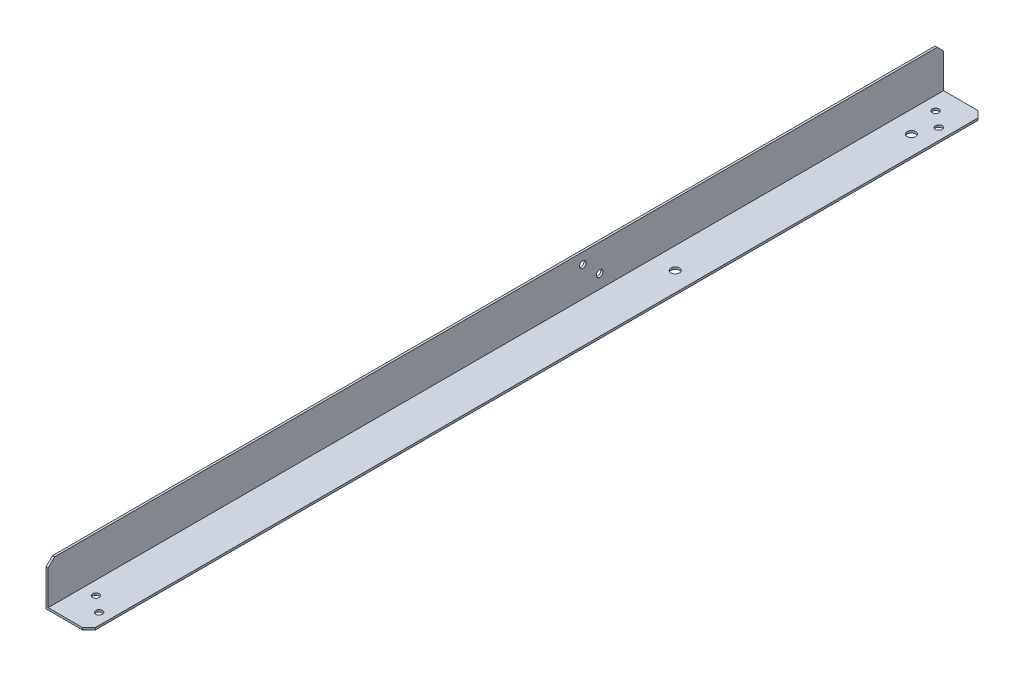
ISO-10303-21;
HEADER;
FILE_DESCRIPTION(('STEP AP214'),'2;1');
FILE_NAME('part.step','',(''),(''),'','','');
FILE_SCHEMA(('AUTOMOTIVE_DESIGN { 1 0 10303 214 1 1 1 1 }'));
ENDSEC;
DATA;
#1=APPLICATION_CONTEXT('core data for automotive mechanical design processes');
#2=APPLICATION_PROTOCOL_DEFINITION('international standard','automotive_design',2000,#1);
#3=PRODUCT_CONTEXT('',#1,'mechanical');
#4=PRODUCT('Part','Part','',(#3));
#5=PRODUCT_RELATED_PRODUCT_CATEGORY('part','',(#4));
#6=PRODUCT_DEFINITION_FORMATION('','',#4);
#7=PRODUCT_DEFINITION_CONTEXT('part definition',#1,'design');
#8=PRODUCT_DEFINITION('design','',#6,#7);
#9=PRODUCT_DEFINITION_SHAPE('','',#8);
#10=(LENGTH_UNIT() NAMED_UNIT(*) SI_UNIT(.MILLI.,.METRE.));
#11=(NAMED_UNIT(*) PLANE_ANGLE_UNIT() SI_UNIT($,.RADIAN.));
#12=(NAMED_UNIT(*) SI_UNIT($,.STERADIAN.) SOLID_ANGLE_UNIT());
#13=UNCERTAINTY_MEASURE_WITH_UNIT(LENGTH_MEASURE(1.E-05),#10,'distance_accuracy_value','');
#14=(GEOMETRIC_REPRESENTATION_CONTEXT(3) GLOBAL_UNCERTAINTY_ASSIGNED_CONTEXT((#13)) GLOBAL_UNIT_ASSIGNED_CONTEXT((#10,
#11,#12)) REPRESENTATION_CONTEXT('',''));
#15=CARTESIAN_POINT('',(0.,0.,0.));
#16=DIRECTION('',(0.,0.,1.));
#17=DIRECTION('',(1.,0.,0.));
#18=AXIS2_PLACEMENT_3D('',#15,#16,#17);
#19=CARTESIAN_POINT('',(0.,20.,417.));
#20=DIRECTION('',(1.,0.,0.));
#21=DIRECTION('',(0.,1.,0.));
#22=AXIS2_PLACEMENT_3D('',#19,#20,#21);
#23=PLANE('',#22);
#24=CARTESIAN_POINT('',(0.,7.35,160.2));
#25=DIRECTION('',(1.,0.,0.));
#26=DIRECTION('',(0.,1.,0.));
#27=AXIS2_PLACEMENT_3D('',#24,#25,#26);
#28=CIRCLE('',#27,1.54999999999999);
#29=CARTESIAN_POINT('',(0.,8.89999999999999,160.2));
#30=VERTEX_POINT('',#29);
#31=EDGE_CURVE('E216',#30,#30,#28,.T.);
#32=ORIENTED_EDGE('',*,*,#31,.T.);
#33=EDGE_LOOP('',(#32));
#34=FACE_BOUND('',#33,.T.);
#35=CARTESIAN_POINT('',(0.,14.85,168.));
#36=DIRECTION('',(1.,0.,0.));
#37=DIRECTION('',(0.,1.,0.));
#38=AXIS2_PLACEMENT_3D('',#35,#36,#37);
#39=CIRCLE('',#38,1.54999999999999);
#40=CARTESIAN_POINT('',(0.,16.4,168.));
#41=VERTEX_POINT('',#40);
#42=EDGE_CURVE('E222',#41,#41,#39,.T.);
#43=ORIENTED_EDGE('',*,*,#42,.T.);
#44=EDGE_LOOP('',(#43));
#45=FACE_BOUND('',#44,.T.);
#46=DIRECTION('',(0.,-1.,0.));
#47=VECTOR('',#46,1.);
#48=CARTESIAN_POINT('',(0.,20.,417.));
#49=LINE('',#48,#47);
#50=CARTESIAN_POINT('',(0.,17.0000000000001,417.));
#51=VERTEX_POINT('',#50);
#52=CARTESIAN_POINT('',(0.,0.,417.));
#53=VERTEX_POINT('',#52);
#54=EDGE_CURVE('E116',#51,#53,#49,.T.);
#55=ORIENTED_EDGE('',*,*,#54,.F.);
#56=DIRECTION('',(0.,0.707106781186541,-0.707106781186554));
#57=VECTOR('',#56,1.);
#58=CARTESIAN_POINT('',(0.,17.0000000000001,417.));
#59=LINE('',#58,#57);
#60=CARTESIAN_POINT('',(0.,20.,414.));
#61=VERTEX_POINT('',#60);
#62=EDGE_CURVE('E165',#51,#61,#59,.T.);
#63=ORIENTED_EDGE('',*,*,#62,.T.);
#64=DIRECTION('',(0.,0.,-1.));
#65=VECTOR('',#64,1.);
#66=CARTESIAN_POINT('',(0.,20.,417.));
#67=LINE('',#66,#65);
#68=CARTESIAN_POINT('',(0.,20.,2.99999999999995));
#69=VERTEX_POINT('',#68);
#70=EDGE_CURVE('E228',#61,#69,#67,.T.);
#71=ORIENTED_EDGE('',*,*,#70,.T.);
#72=DIRECTION('',(0.,0.707106781186554,0.707106781186541));
#73=VECTOR('',#72,1.);
#74=CARTESIAN_POINT('',(0.,20.,2.99999999999995));
#75=LINE('',#74,#73);
#76=CARTESIAN_POINT('',(0.,17.,0.));
#77=VERTEX_POINT('',#76);
#78=EDGE_CURVE('E163',#69,#77,#75,.F.);
#79=ORIENTED_EDGE('',*,*,#78,.T.);
#80=DIRECTION('',(0.,-1.,0.));
#81=VECTOR('',#80,1.);
#82=CARTESIAN_POINT('',(0.,20.,0.));
#83=LINE('',#82,#81);
#84=CARTESIAN_POINT('',(0.,0.,0.));
#85=VERTEX_POINT('',#84);
#86=EDGE_CURVE('E139',#77,#85,#83,.T.);
#87=ORIENTED_EDGE('',*,*,#86,.T.);
#88=DIRECTION('',(0.,0.,-1.));
#89=VECTOR('',#88,1.);
#90=CARTESIAN_POINT('',(0.,0.,417.));
#91=LINE('',#90,#89);
#92=EDGE_CURVE('E134',#53,#85,#91,.T.);
#93=ORIENTED_EDGE('',*,*,#92,.F.);
#94=EDGE_LOOP('',(#55,#63,#71,#79,#87,#93));
#95=FACE_BOUND('',#94,.T.);
#96=ADVANCED_FACE('F35',(#34,#45,#95),#23,.F.);
#97=CARTESIAN_POINT('',(0.,0.,417.));
#98=DIRECTION('',(0.,1.,0.));
#99=DIRECTION('',(0.,0.,1.));
#100=AXIS2_PLACEMENT_3D('',#97,#98,#99);
#101=PLANE('',#100);
#102=CARTESIAN_POINT('',(11.,0.,25.));
#103=DIRECTION('',(0.,-1.,0.));
#104=DIRECTION('',(0.,0.,-1.));
#105=AXIS2_PLACEMENT_3D('',#102,#103,#104);
#106=CIRCLE('',#105,2.);
#107=CARTESIAN_POINT('',(11.,0.,23.));
#108=VERTEX_POINT('',#107);
#109=EDGE_CURVE('E192',#108,#108,#106,.T.);
#110=ORIENTED_EDGE('',*,*,#109,.F.);
#111=EDGE_LOOP('',(#110));
#112=FACE_BOUND('',#111,.T.);
#113=CARTESIAN_POINT('',(11.,0.,135.));
#114=DIRECTION('',(0.,-1.,0.));
#115=DIRECTION('',(0.,0.,-1.));
#116=AXIS2_PLACEMENT_3D('',#113,#114,#115);
#117=CIRCLE('',#116,2.);
#118=CARTESIAN_POINT('',(11.,0.,133.));
#119=VERTEX_POINT('',#118);
#120=EDGE_CURVE('E198',#119,#119,#117,.T.);
#121=ORIENTED_EDGE('',*,*,#120,.F.);
#122=EDGE_LOOP('',(#121));
#123=FACE_BOUND('',#122,.T.);
#124=CARTESIAN_POINT('',(14.7499999999952,0.,16.));
#125=DIRECTION('',(0.,-1.,0.));
#126=DIRECTION('',(0.,0.,-1.));
#127=AXIS2_PLACEMENT_3D('',#124,#125,#126);
#128=CIRCLE('',#127,1.55);
#129=CARTESIAN_POINT('',(14.7499999999952,0.,14.45));
#130=VERTEX_POINT('',#129);
#131=EDGE_CURVE('E185',#130,#130,#128,.T.);
#132=ORIENTED_EDGE('',*,*,#131,.F.);
#133=EDGE_LOOP('',(#132));
#134=FACE_BOUND('',#133,.T.);
#135=CARTESIAN_POINT('',(7.24999999999503,0.,401.));
#136=DIRECTION('',(0.,-1.,0.));
#137=DIRECTION('',(0.,0.,-1.));
#138=AXIS2_PLACEMENT_3D('',#135,#136,#137);
#139=CIRCLE('',#138,1.55000000000001);
#140=CARTESIAN_POINT('',(7.24999999999503,0.,399.45));
#141=VERTEX_POINT('',#140);
#142=EDGE_CURVE('E207',#141,#141,#139,.T.);
#143=ORIENTED_EDGE('',*,*,#142,.F.);
#144=EDGE_LOOP('',(#143));
#145=FACE_BOUND('',#144,.T.);
#146=CARTESIAN_POINT('',(14.749999999995,0.,407.));
#147=DIRECTION('',(0.,-1.,0.));
#148=DIRECTION('',(0.,0.,-1.));
#149=AXIS2_PLACEMENT_3D('',#146,#147,#148);
#150=CIRCLE('',#149,1.55000000000001);
#151=CARTESIAN_POINT('',(14.749999999995,0.,405.45));
#152=VERTEX_POINT('',#151);
#153=EDGE_CURVE('E196',#152,#152,#150,.T.);
#154=ORIENTED_EDGE('',*,*,#153,.F.);
#155=EDGE_LOOP('',(#154));
#156=FACE_BOUND('',#155,.T.);
#157=CARTESIAN_POINT('',(7.24999999999519,0.,9.9999999999999));
#158=DIRECTION('',(0.,-1.,0.));
#159=DIRECTION('',(0.,0.,-1.));
#160=AXIS2_PLACEMENT_3D('',#157,#158,#159);
#161=CIRCLE('',#160,1.55);
#162=CARTESIAN_POINT('',(7.24999999999519,0.,8.4499999999999));
#163=VERTEX_POINT('',#162);
#164=EDGE_CURVE('E180',#163,#163,#161,.T.);
#165=ORIENTED_EDGE('',*,*,#164,.F.);
#166=EDGE_LOOP('',(#165));
#167=FACE_BOUND('',#166,.T.);
#168=DIRECTION('',(0.,0.,-1.));
#169=VECTOR('',#168,1.);
#170=CARTESIAN_POINT('',(20.,0.,417.));
#171=LINE('',#170,#169);
#172=CARTESIAN_POINT('',(20.,0.,414.));
#173=VERTEX_POINT('',#172);
#174=CARTESIAN_POINT('',(20.,0.,2.99999999999995));
#175=VERTEX_POINT('',#174);
#176=EDGE_CURVE('E141',#173,#175,#171,.T.);
#177=ORIENTED_EDGE('',*,*,#176,.F.);
#178=DIRECTION('',(-0.707106781186541,0.,0.707106781186554));
#179=VECTOR('',#178,1.);
#180=CARTESIAN_POINT('',(17.0000000000001,0.,417.));
#181=LINE('',#180,#179);
#182=CARTESIAN_POINT('',(17.0000000000001,0.,417.));
#183=VERTEX_POINT('',#182);
#184=EDGE_CURVE('E136',#173,#183,#181,.T.);
#185=ORIENTED_EDGE('',*,*,#184,.T.);
#186=DIRECTION('',(1.,0.,0.));
#187=VECTOR('',#186,1.);
#188=CARTESIAN_POINT('',(0.,0.,417.));
#189=LINE('',#188,#187);
#190=EDGE_CURVE('E120',#53,#183,#189,.T.);
#191=ORIENTED_EDGE('',*,*,#190,.F.);
#192=ORIENTED_EDGE('',*,*,#92,.T.);
#193=DIRECTION('',(1.,0.,0.));
#194=VECTOR('',#193,1.);
#195=CARTESIAN_POINT('',(0.,0.,0.));
#196=LINE('',#195,#194);
#197=CARTESIAN_POINT('',(17.,0.,0.));
#198=VERTEX_POINT('',#197);
#199=EDGE_CURVE('E230',#85,#198,#196,.T.);
#200=ORIENTED_EDGE('',*,*,#199,.T.);
#201=DIRECTION('',(-0.707106781186554,0.,-0.707106781186541));
#202=VECTOR('',#201,1.);
#203=CARTESIAN_POINT('',(20.,0.,2.99999999999995));
#204=LINE('',#203,#202);
#205=EDGE_CURVE('E160',#198,#175,#204,.F.);
#206=ORIENTED_EDGE('',*,*,#205,.T.);
#207=EDGE_LOOP('',(#177,#185,#191,#192,#200,#206));
#208=FACE_BOUND('',#207,.T.);
#209=ADVANCED_FACE('F132',(#112,#123,#134,#145,#156,#167,#208),#101,.F.);
#210=CARTESIAN_POINT('',(20.,0.,417.));
#211=DIRECTION('',(-1.,0.,0.));
#212=DIRECTION('',(0.,0.,1.));
#213=AXIS2_PLACEMENT_3D('',#210,#211,#212);
#214=PLANE('',#213);
#215=DIRECTION('',(0.,0.,-1.));
#216=VECTOR('',#215,1.);
#217=CARTESIAN_POINT('',(20.,1.,417.));
#218=LINE('',#217,#216);
#219=CARTESIAN_POINT('',(20.,1.,414.));
#220=VERTEX_POINT('',#219);
#221=CARTESIAN_POINT('',(20.,1.,2.99999999999995));
#222=VERTEX_POINT('',#221);
#223=EDGE_CURVE('E146',#220,#222,#218,.T.);
#224=ORIENTED_EDGE('',*,*,#223,.F.);
#225=DIRECTION('',(0.,-1.,0.));
#226=VECTOR('',#225,1.);
#227=CARTESIAN_POINT('',(20.,0.,414.));
#228=LINE('',#227,#226);
#229=EDGE_CURVE('E158',#220,#173,#228,.T.);
#230=ORIENTED_EDGE('',*,*,#229,.T.);
#231=ORIENTED_EDGE('',*,*,#176,.T.);
#232=DIRECTION('',(0.,1.,0.));
#233=VECTOR('',#232,1.);
#234=CARTESIAN_POINT('',(20.,0.,2.99999999999995));
#235=LINE('',#234,#233);
#236=EDGE_CURVE('E155',#175,#222,#235,.T.);
#237=ORIENTED_EDGE('',*,*,#236,.T.);
#238=EDGE_LOOP('',(#224,#230,#231,#237));
#239=FACE_BOUND('',#238,.T.);
#240=ADVANCED_FACE('F249',(#239),#214,.F.);
#241=CARTESIAN_POINT('',(20.,1.,417.));
#242=DIRECTION('',(0.,-1.,0.));
#243=DIRECTION('',(1.,0.,0.));
#244=AXIS2_PLACEMENT_3D('',#241,#242,#243);
#245=PLANE('',#244);
#246=CARTESIAN_POINT('',(11.,1.,25.));
#247=DIRECTION('',(0.,-1.,0.));
#248=DIRECTION('',(1.,0.,0.));
#249=AXIS2_PLACEMENT_3D('',#246,#247,#248);
#250=CIRCLE('',#249,2.);
#251=CARTESIAN_POINT('',(13.,1.,25.));
#252=VERTEX_POINT('',#251);
#253=EDGE_CURVE('E39',#252,#252,#250,.T.);
#254=ORIENTED_EDGE('',*,*,#253,.T.);
#255=EDGE_LOOP('',(#254));
#256=FACE_BOUND('',#255,.T.);
#257=CARTESIAN_POINT('',(11.,1.,135.));
#258=DIRECTION('',(0.,-1.,0.));
#259=DIRECTION('',(1.,0.,0.));
#260=AXIS2_PLACEMENT_3D('',#257,#258,#259);
#261=CIRCLE('',#260,2.);
#262=CARTESIAN_POINT('',(13.,1.,135.));
#263=VERTEX_POINT('',#262);
#264=EDGE_CURVE('E190',#263,#263,#261,.T.);
#265=ORIENTED_EDGE('',*,*,#264,.T.);
#266=EDGE_LOOP('',(#265));
#267=FACE_BOUND('',#266,.T.);
#268=CARTESIAN_POINT('',(14.7499999999952,1.,16.));
#269=DIRECTION('',(0.,-1.,0.));
#270=DIRECTION('',(1.,0.,0.));
#271=AXIS2_PLACEMENT_3D('',#268,#269,#270);
#272=CIRCLE('',#271,1.55);
#273=CARTESIAN_POINT('',(16.2999999999952,1.,16.));
#274=VERTEX_POINT('',#273);
#275=EDGE_CURVE('E188',#274,#274,#272,.T.);
#276=ORIENTED_EDGE('',*,*,#275,.T.);
#277=EDGE_LOOP('',(#276));
#278=FACE_BOUND('',#277,.T.);
#279=CARTESIAN_POINT('',(7.24999999999503,1.,401.));
#280=DIRECTION('',(0.,-1.,0.));
#281=DIRECTION('',(1.,0.,0.));
#282=AXIS2_PLACEMENT_3D('',#279,#280,#281);
#283=CIRCLE('',#282,1.55000000000001);
#284=CARTESIAN_POINT('',(8.79999999999503,1.,401.));
#285=VERTEX_POINT('',#284);
#286=EDGE_CURVE('E184',#285,#285,#283,.T.);
#287=ORIENTED_EDGE('',*,*,#286,.T.);
#288=EDGE_LOOP('',(#287));
#289=FACE_BOUND('',#288,.T.);
#290=CARTESIAN_POINT('',(14.749999999995,1.,407.));
#291=DIRECTION('',(0.,-1.,0.));
#292=DIRECTION('',(1.,0.,0.));
#293=AXIS2_PLACEMENT_3D('',#290,#291,#292);
#294=CIRCLE('',#293,1.55000000000001);
#295=CARTESIAN_POINT('',(16.299999999995,1.,407.));
#296=VERTEX_POINT('',#295);
#297=EDGE_CURVE('E181',#296,#296,#294,.T.);
#298=ORIENTED_EDGE('',*,*,#297,.T.);
#299=EDGE_LOOP('',(#298));
#300=FACE_BOUND('',#299,.T.);
#301=CARTESIAN_POINT('',(7.24999999999519,1.,9.9999999999999));
#302=DIRECTION('',(0.,-1.,0.));
#303=DIRECTION('',(1.,0.,0.));
#304=AXIS2_PLACEMENT_3D('',#301,#302,#303);
#305=CIRCLE('',#304,1.55);
#306=CARTESIAN_POINT('',(8.79999999999519,1.,9.9999999999999));
#307=VERTEX_POINT('',#306);
#308=EDGE_CURVE('E176',#307,#307,#305,.T.);
#309=ORIENTED_EDGE('',*,*,#308,.T.);
#310=EDGE_LOOP('',(#309));
#311=FACE_BOUND('',#310,.T.);
#312=DIRECTION('',(-1.,0.,0.));
#313=VECTOR('',#312,1.);
#314=CARTESIAN_POINT('',(20.,1.,417.));
#315=LINE('',#314,#313);
#316=CARTESIAN_POINT('',(17.0000000000001,1.,417.));
#317=VERTEX_POINT('',#316);
#318=CARTESIAN_POINT('',(1.,0.999999999999998,417.));
#319=VERTEX_POINT('',#318);
#320=EDGE_CURVE('E137',#317,#319,#315,.T.);
#321=ORIENTED_EDGE('',*,*,#320,.F.);
#322=DIRECTION('',(0.707106781186541,0.,-0.707106781186554));
#323=VECTOR('',#322,1.);
#324=CARTESIAN_POINT('',(17.0000000000001,1.,417.));
#325=LINE('',#324,#323);
#326=EDGE_CURVE('E153',#317,#220,#325,.T.);
#327=ORIENTED_EDGE('',*,*,#326,.T.);
#328=ORIENTED_EDGE('',*,*,#223,.T.);
#329=DIRECTION('',(0.707106781186554,0.,0.707106781186541));
#330=VECTOR('',#329,1.);
#331=CARTESIAN_POINT('',(20.,1.,2.99999999999995));
#332=LINE('',#331,#330);
#333=CARTESIAN_POINT('',(17.,1.,0.));
#334=VERTEX_POINT('',#333);
#335=EDGE_CURVE('E151',#222,#334,#332,.F.);
#336=ORIENTED_EDGE('',*,*,#335,.T.);
#337=DIRECTION('',(-1.,0.,0.));
#338=VECTOR('',#337,1.);
#339=CARTESIAN_POINT('',(20.,1.,0.));
#340=LINE('',#339,#338);
#341=CARTESIAN_POINT('',(1.,0.999999999999998,0.));
#342=VERTEX_POINT('',#341);
#343=EDGE_CURVE('E232',#334,#342,#340,.T.);
#344=ORIENTED_EDGE('',*,*,#343,.T.);
#345=DIRECTION('',(0.,0.,-1.));
#346=VECTOR('',#345,1.);
#347=CARTESIAN_POINT('',(1.,0.999999999999998,417.));
#348=LINE('',#347,#346);
#349=EDGE_CURVE('E239',#319,#342,#348,.T.);
#350=ORIENTED_EDGE('',*,*,#349,.F.);
#351=EDGE_LOOP('',(#321,#327,#328,#336,#344,#350));
#352=FACE_BOUND('',#351,.T.);
#353=ADVANCED_FACE('F245',(#256,#267,#278,#289,#300,#311,#352),#245,.F.);
#354=CARTESIAN_POINT('',(1.,0.999999999999998,417.));
#355=DIRECTION('',(-1.,0.,0.));
#356=DIRECTION('',(0.,-1.,0.));
#357=AXIS2_PLACEMENT_3D('',#354,#355,#356);
#358=PLANE('',#357);
#359=CARTESIAN_POINT('',(1.,7.35,160.2));
#360=DIRECTION('',(1.,0.,0.));
#361=DIRECTION('',(0.,1.,0.));
#362=AXIS2_PLACEMENT_3D('',#359,#360,#361);
#363=CIRCLE('',#362,1.54999999999999);
#364=CARTESIAN_POINT('',(1.,8.89999999999999,160.2));
#365=VERTEX_POINT('',#364);
#366=EDGE_CURVE('E179',#365,#365,#363,.T.);
#367=ORIENTED_EDGE('',*,*,#366,.F.);
#368=EDGE_LOOP('',(#367));
#369=FACE_BOUND('',#368,.T.);
#370=CARTESIAN_POINT('',(1.,14.85,168.));
#371=DIRECTION('',(1.,0.,0.));
#372=DIRECTION('',(0.,1.,0.));
#373=AXIS2_PLACEMENT_3D('',#370,#371,#372);
#374=CIRCLE('',#373,1.54999999999999);
#375=CARTESIAN_POINT('',(1.,16.4,168.));
#376=VERTEX_POINT('',#375);
#377=EDGE_CURVE('E219',#376,#376,#374,.T.);
#378=ORIENTED_EDGE('',*,*,#377,.F.);
#379=EDGE_LOOP('',(#378));
#380=FACE_BOUND('',#379,.T.);
#381=DIRECTION('',(0.,0.,-1.));
#382=VECTOR('',#381,1.);
#383=CARTESIAN_POINT('',(1.,20.,417.));
#384=LINE('',#383,#382);
#385=CARTESIAN_POINT('',(1.,20.,414.));
#386=VERTEX_POINT('',#385);
#387=CARTESIAN_POINT('',(1.,20.,2.99999999999995));
#388=VERTEX_POINT('',#387);
#389=EDGE_CURVE('E237',#386,#388,#384,.T.);
#390=ORIENTED_EDGE('',*,*,#389,.F.);
#391=DIRECTION('',(0.,-0.707106781186541,0.707106781186554));
#392=VECTOR('',#391,1.);
#393=CARTESIAN_POINT('',(1.,17.0000000000001,417.));
#394=LINE('',#393,#392);
#395=CARTESIAN_POINT('',(1.,17.0000000000001,417.));
#396=VERTEX_POINT('',#395);
#397=EDGE_CURVE('E173',#386,#396,#394,.T.);
#398=ORIENTED_EDGE('',*,*,#397,.T.);
#399=DIRECTION('',(0.,1.,0.));
#400=VECTOR('',#399,1.);
#401=CARTESIAN_POINT('',(1.,0.999999999999998,417.));
#402=LINE('',#401,#400);
#403=EDGE_CURVE('E226',#319,#396,#402,.T.);
#404=ORIENTED_EDGE('',*,*,#403,.F.);
#405=ORIENTED_EDGE('',*,*,#349,.T.);
#406=DIRECTION('',(0.,1.,0.));
#407=VECTOR('',#406,1.);
#408=CARTESIAN_POINT('',(1.,0.999999999999998,0.));
#409=LINE('',#408,#407);
#410=CARTESIAN_POINT('',(1.,17.,0.));
#411=VERTEX_POINT('',#410);
#412=EDGE_CURVE('E127',#342,#411,#409,.T.);
#413=ORIENTED_EDGE('',*,*,#412,.T.);
#414=DIRECTION('',(0.,-0.707106781186554,-0.707106781186541));
#415=VECTOR('',#414,1.);
#416=CARTESIAN_POINT('',(1.,20.,2.99999999999995));
#417=LINE('',#416,#415);
#418=EDGE_CURVE('E57',#411,#388,#417,.F.);
#419=ORIENTED_EDGE('',*,*,#418,.T.);
#420=EDGE_LOOP('',(#390,#398,#404,#405,#413,#419));
#421=FACE_BOUND('',#420,.T.);
#422=ADVANCED_FACE('F255',(#369,#380,#421),#358,.F.);
#423=CARTESIAN_POINT('',(1.,20.,417.));
#424=DIRECTION('',(0.,-1.,0.));
#425=DIRECTION('',(0.,0.,-1.));
#426=AXIS2_PLACEMENT_3D('',#423,#424,#425);
#427=PLANE('',#426);
#428=ORIENTED_EDGE('',*,*,#70,.F.);
#429=DIRECTION('',(1.,0.,0.));
#430=VECTOR('',#429,1.);
#431=CARTESIAN_POINT('',(1.,20.,414.));
#432=LINE('',#431,#430);
#433=EDGE_CURVE('E170',#61,#386,#432,.T.);
#434=ORIENTED_EDGE('',*,*,#433,.T.);
#435=ORIENTED_EDGE('',*,*,#389,.T.);
#436=DIRECTION('',(-1.,0.,0.));
#437=VECTOR('',#436,1.);
#438=CARTESIAN_POINT('',(1.,20.,2.99999999999995));
#439=LINE('',#438,#437);
#440=EDGE_CURVE('E167',#388,#69,#439,.T.);
#441=ORIENTED_EDGE('',*,*,#440,.T.);
#442=EDGE_LOOP('',(#428,#434,#435,#441));
#443=FACE_BOUND('',#442,.T.);
#444=ADVANCED_FACE('F262',(#443),#427,.F.);
#445=CARTESIAN_POINT('',(0.,0.,417.));
#446=DIRECTION('',(0.,0.,1.));
#447=DIRECTION('',(1.,0.,0.));
#448=AXIS2_PLACEMENT_3D('',#445,#446,#447);
#449=PLANE('',#448);
#450=ORIENTED_EDGE('',*,*,#190,.T.);
#451=DIRECTION('',(0.,1.,0.));
#452=VECTOR('',#451,1.);
#453=CARTESIAN_POINT('',(17.0000000000001,1.,417.));
#454=LINE('',#453,#452);
#455=EDGE_CURVE('E143',#183,#317,#454,.T.);
#456=ORIENTED_EDGE('',*,*,#455,.T.);
#457=ORIENTED_EDGE('',*,*,#320,.T.);
#458=ORIENTED_EDGE('',*,*,#403,.T.);
#459=DIRECTION('',(-1.,0.,0.));
#460=VECTOR('',#459,1.);
#461=CARTESIAN_POINT('',(0.,17.0000000000001,417.));
#462=LINE('',#461,#460);
#463=EDGE_CURVE('E124',#396,#51,#462,.T.);
#464=ORIENTED_EDGE('',*,*,#463,.T.);
#465=ORIENTED_EDGE('',*,*,#54,.T.);
#466=EDGE_LOOP('',(#450,#456,#457,#458,#464,#465));
#467=FACE_BOUND('',#466,.T.);
#468=ADVANCED_FACE('F118',(#467),#449,.T.);
#469=CARTESIAN_POINT('',(0.,0.,0.));
#470=DIRECTION('',(0.,0.,1.));
#471=DIRECTION('',(1.,0.,0.));
#472=AXIS2_PLACEMENT_3D('',#469,#470,#471);
#473=PLANE('',#472);
#474=ORIENTED_EDGE('',*,*,#86,.F.);
#475=DIRECTION('',(1.,0.,0.));
#476=VECTOR('',#475,1.);
#477=CARTESIAN_POINT('',(0.,17.,0.));
#478=LINE('',#477,#476);
#479=EDGE_CURVE('E11',#77,#411,#478,.T.);
#480=ORIENTED_EDGE('',*,*,#479,.T.);
#481=ORIENTED_EDGE('',*,*,#412,.F.);
#482=ORIENTED_EDGE('',*,*,#343,.F.);
#483=DIRECTION('',(0.,-1.,0.));
#484=VECTOR('',#483,1.);
#485=CARTESIAN_POINT('',(17.,0.,0.));
#486=LINE('',#485,#484);
#487=EDGE_CURVE('E44',#334,#198,#486,.T.);
#488=ORIENTED_EDGE('',*,*,#487,.T.);
#489=ORIENTED_EDGE('',*,*,#199,.F.);
#490=EDGE_LOOP('',(#474,#480,#481,#482,#488,#489));
#491=FACE_BOUND('',#490,.T.);
#492=ADVANCED_FACE('F266',(#491),#473,.F.);
#493=CARTESIAN_POINT('',(17.0000000000001,0.,417.));
#494=DIRECTION('',(0.707106781186554,0.,0.707106781186541));
#495=DIRECTION('',(0.,-1.,0.));
#496=AXIS2_PLACEMENT_3D('',#493,#494,#495);
#497=PLANE('',#496);
#498=ORIENTED_EDGE('',*,*,#184,.F.);
#499=ORIENTED_EDGE('',*,*,#229,.F.);
#500=ORIENTED_EDGE('',*,*,#326,.F.);
#501=ORIENTED_EDGE('',*,*,#455,.F.);
#502=EDGE_LOOP('',(#498,#499,#500,#501));
#503=FACE_BOUND('',#502,.T.);
#504=ADVANCED_FACE('F252',(#503),#497,.T.);
#505=CARTESIAN_POINT('',(0.,17.0000000000001,417.));
#506=DIRECTION('',(0.,0.707106781186554,0.707106781186541));
#507=DIRECTION('',(1.,0.,0.));
#508=AXIS2_PLACEMENT_3D('',#505,#506,#507);
#509=PLANE('',#508);
#510=ORIENTED_EDGE('',*,*,#397,.F.);
#511=ORIENTED_EDGE('',*,*,#433,.F.);
#512=ORIENTED_EDGE('',*,*,#62,.F.);
#513=ORIENTED_EDGE('',*,*,#463,.F.);
#514=EDGE_LOOP('',(#510,#511,#512,#513));
#515=FACE_BOUND('',#514,.T.);
#516=ADVANCED_FACE('F258',(#515),#509,.T.);
#517=CARTESIAN_POINT('',(1.,20.,2.99999999999995));
#518=DIRECTION('',(0.,-0.707106781186541,0.707106781186554));
#519=DIRECTION('',(-1.,0.,0.));
#520=AXIS2_PLACEMENT_3D('',#517,#518,#519);
#521=PLANE('',#520);
#522=ORIENTED_EDGE('',*,*,#418,.F.);
#523=ORIENTED_EDGE('',*,*,#479,.F.);
#524=ORIENTED_EDGE('',*,*,#78,.F.);
#525=ORIENTED_EDGE('',*,*,#440,.F.);
#526=EDGE_LOOP('',(#522,#523,#524,#525));
#527=FACE_BOUND('',#526,.T.);
#528=ADVANCED_FACE('F265',(#527),#521,.F.);
#529=CARTESIAN_POINT('',(20.,0.,2.99999999999995));
#530=DIRECTION('',(-0.707106781186541,0.,0.707106781186554));
#531=DIRECTION('',(0.,1.,0.));
#532=AXIS2_PLACEMENT_3D('',#529,#530,#531);
#533=PLANE('',#532);
#534=ORIENTED_EDGE('',*,*,#205,.F.);
#535=ORIENTED_EDGE('',*,*,#487,.F.);
#536=ORIENTED_EDGE('',*,*,#335,.F.);
#537=ORIENTED_EDGE('',*,*,#236,.F.);
#538=EDGE_LOOP('',(#534,#535,#536,#537));
#539=FACE_BOUND('',#538,.T.);
#540=ADVANCED_FACE('F37',(#539),#533,.F.);
#541=CARTESIAN_POINT('',(-9.,14.85,168.));
#542=DIRECTION('',(1.,0.,0.));
#543=DIRECTION('',(0.,1.,0.));
#544=AXIS2_PLACEMENT_3D('',#541,#542,#543);
#545=CYLINDRICAL_SURFACE('',#544,1.54999999999999);
#546=ORIENTED_EDGE('',*,*,#377,.T.);
#547=EDGE_LOOP('',(#546));
#548=FACE_BOUND('',#547,.T.);
#549=ORIENTED_EDGE('',*,*,#42,.F.);
#550=EDGE_LOOP('',(#549));
#551=FACE_BOUND('',#550,.T.);
#552=ADVANCED_FACE('F271',(#548,#551),#545,.F.);
#553=CARTESIAN_POINT('',(-9.,7.35,160.2));
#554=DIRECTION('',(1.,0.,0.));
#555=DIRECTION('',(0.,1.,0.));
#556=AXIS2_PLACEMENT_3D('',#553,#554,#555);
#557=CYLINDRICAL_SURFACE('',#556,1.54999999999999);
#558=ORIENTED_EDGE('',*,*,#366,.T.);
#559=EDGE_LOOP('',(#558));
#560=FACE_BOUND('',#559,.T.);
#561=ORIENTED_EDGE('',*,*,#31,.F.);
#562=EDGE_LOOP('',(#561));
#563=FACE_BOUND('',#562,.T.);
#564=ADVANCED_FACE('F276',(#560,#563),#557,.F.);
#565=CARTESIAN_POINT('',(7.24999999999519,20.,9.9999999999999));
#566=DIRECTION('',(0.,-1.,0.));
#567=DIRECTION('',(0.,0.,-1.));
#568=AXIS2_PLACEMENT_3D('',#565,#566,#567);
#569=CYLINDRICAL_SURFACE('',#568,1.55);
#570=ORIENTED_EDGE('',*,*,#164,.T.);
#571=EDGE_LOOP('',(#570));
#572=FACE_BOUND('',#571,.T.);
#573=ORIENTED_EDGE('',*,*,#308,.F.);
#574=EDGE_LOOP('',(#573));
#575=FACE_BOUND('',#574,.T.);
#576=ADVANCED_FACE('F339',(#572,#575),#569,.F.);
#577=CARTESIAN_POINT('',(14.749999999995,20.,407.));
#578=DIRECTION('',(0.,-1.,0.));
#579=DIRECTION('',(0.,0.,-1.));
#580=AXIS2_PLACEMENT_3D('',#577,#578,#579);
#581=CYLINDRICAL_SURFACE('',#580,1.55000000000001);
#582=ORIENTED_EDGE('',*,*,#153,.T.);
#583=EDGE_LOOP('',(#582));
#584=FACE_BOUND('',#583,.T.);
#585=ORIENTED_EDGE('',*,*,#297,.F.);
#586=EDGE_LOOP('',(#585));
#587=FACE_BOUND('',#586,.T.);
#588=ADVANCED_FACE('F349',(#584,#587),#581,.F.);
#589=CARTESIAN_POINT('',(7.24999999999503,20.,401.));
#590=DIRECTION('',(0.,-1.,0.));
#591=DIRECTION('',(0.,0.,-1.));
#592=AXIS2_PLACEMENT_3D('',#589,#590,#591);
#593=CYLINDRICAL_SURFACE('',#592,1.55000000000001);
#594=ORIENTED_EDGE('',*,*,#142,.T.);
#595=EDGE_LOOP('',(#594));
#596=FACE_BOUND('',#595,.T.);
#597=ORIENTED_EDGE('',*,*,#286,.F.);
#598=EDGE_LOOP('',(#597));
#599=FACE_BOUND('',#598,.T.);
#600=ADVANCED_FACE('F359',(#596,#599),#593,.F.);
#601=CARTESIAN_POINT('',(14.7499999999952,20.,16.));
#602=DIRECTION('',(0.,-1.,0.));
#603=DIRECTION('',(0.,0.,-1.));
#604=AXIS2_PLACEMENT_3D('',#601,#602,#603);
#605=CYLINDRICAL_SURFACE('',#604,1.55);
#606=ORIENTED_EDGE('',*,*,#131,.T.);
#607=EDGE_LOOP('',(#606));
#608=FACE_BOUND('',#607,.T.);
#609=ORIENTED_EDGE('',*,*,#275,.F.);
#610=EDGE_LOOP('',(#609));
#611=FACE_BOUND('',#610,.T.);
#612=ADVANCED_FACE('F369',(#608,#611),#605,.F.);
#613=CARTESIAN_POINT('',(11.,20.,135.));
#614=DIRECTION('',(0.,-1.,0.));
#615=DIRECTION('',(0.,0.,-1.));
#616=AXIS2_PLACEMENT_3D('',#613,#614,#615);
#617=CYLINDRICAL_SURFACE('',#616,2.);
#618=ORIENTED_EDGE('',*,*,#120,.T.);
#619=EDGE_LOOP('',(#618));
#620=FACE_BOUND('',#619,.T.);
#621=ORIENTED_EDGE('',*,*,#264,.F.);
#622=EDGE_LOOP('',(#621));
#623=FACE_BOUND('',#622,.T.);
#624=ADVANCED_FACE('F379',(#620,#623),#617,.F.);
#625=CARTESIAN_POINT('',(11.,20.,25.));
#626=DIRECTION('',(0.,-1.,0.));
#627=DIRECTION('',(0.,0.,-1.));
#628=AXIS2_PLACEMENT_3D('',#625,#626,#627);
#629=CYLINDRICAL_SURFACE('',#628,2.);
#630=ORIENTED_EDGE('',*,*,#109,.T.);
#631=EDGE_LOOP('',(#630));
#632=FACE_BOUND('',#631,.T.);
#633=ORIENTED_EDGE('',*,*,#253,.F.);
#634=EDGE_LOOP('',(#633));
#635=FACE_BOUND('',#634,.T.);
#636=ADVANCED_FACE('F403',(#632,#635),#629,.F.);
#637=CLOSED_SHELL('',(#96,#209,#240,#353,#422,#444,#468,#492,#504,#516,#528,#540,#552,#564,#576,
#588,#600,#612,#624,#636));
#638=MANIFOLD_SOLID_BREP('B2',#637);
#639=ADVANCED_BREP_SHAPE_REPRESENTATION('',(#18,#638),#14);
#640=SHAPE_DEFINITION_REPRESENTATION(#9,#639);
ENDSEC;
END-ISO-10303-21;
